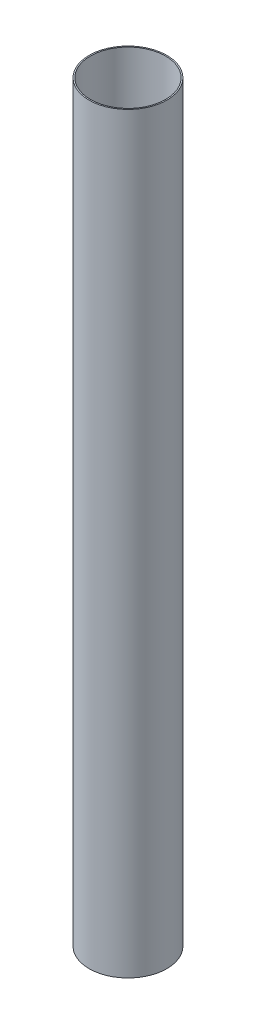
ISO-10303-21;
HEADER;
FILE_DESCRIPTION(('STEP AP214'),'2;1');
FILE_NAME('part.step','',(''),(''),'','','');
FILE_SCHEMA(('AUTOMOTIVE_DESIGN { 1 0 10303 214 1 1 1 1 }'));
ENDSEC;
DATA;
#1=APPLICATION_CONTEXT('core data for automotive mechanical design processes');
#2=APPLICATION_PROTOCOL_DEFINITION('international standard','automotive_design',2000,#1);
#3=PRODUCT_CONTEXT('',#1,'mechanical');
#4=PRODUCT('Part','Part','',(#3));
#5=PRODUCT_RELATED_PRODUCT_CATEGORY('part','',(#4));
#6=PRODUCT_DEFINITION_FORMATION('','',#4);
#7=PRODUCT_DEFINITION_CONTEXT('part definition',#1,'design');
#8=PRODUCT_DEFINITION('design','',#6,#7);
#9=PRODUCT_DEFINITION_SHAPE('','',#8);
#10=(LENGTH_UNIT() NAMED_UNIT(*) SI_UNIT(.MILLI.,.METRE.));
#11=(NAMED_UNIT(*) PLANE_ANGLE_UNIT() SI_UNIT($,.RADIAN.));
#12=(NAMED_UNIT(*) SI_UNIT($,.STERADIAN.) SOLID_ANGLE_UNIT());
#13=UNCERTAINTY_MEASURE_WITH_UNIT(LENGTH_MEASURE(1.E-05),#10,'distance_accuracy_value','');
#14=(GEOMETRIC_REPRESENTATION_CONTEXT(3) GLOBAL_UNCERTAINTY_ASSIGNED_CONTEXT((#13)) GLOBAL_UNIT_ASSIGNED_CONTEXT((#10,
#11,#12)) REPRESENTATION_CONTEXT('',''));
#15=CARTESIAN_POINT('',(0.,0.,0.));
#16=DIRECTION('',(0.,0.,1.));
#17=DIRECTION('',(1.,0.,0.));
#18=AXIS2_PLACEMENT_3D('',#15,#16,#17);
#19=CARTESIAN_POINT('',(0.,762.,0.));
#20=DIRECTION('',(0.,1.,0.));
#21=DIRECTION('',(0.,0.,1.));
#22=AXIS2_PLACEMENT_3D('',#19,#20,#21);
#23=PLANE('',#22);
#24=CARTESIAN_POINT('',(0.,762.,0.));
#25=DIRECTION('',(0.,1.,0.));
#26=DIRECTION('',(0.,0.,1.));
#27=AXIS2_PLACEMENT_3D('',#24,#25,#26);
#28=CIRCLE('',#27,39.37);
#29=CARTESIAN_POINT('',(0.,762.,39.37));
#30=VERTEX_POINT('',#29);
#31=EDGE_CURVE('E10',#30,#30,#28,.T.);
#32=ORIENTED_EDGE('',*,*,#31,.T.);
#33=EDGE_LOOP('',(#32));
#34=FACE_BOUND('',#33,.T.);
#35=CARTESIAN_POINT('',(0.,762.,0.));
#36=DIRECTION('',(0.,1.,0.));
#37=DIRECTION('',(0.,0.,1.));
#38=AXIS2_PLACEMENT_3D('',#35,#36,#37);
#39=CIRCLE('',#38,38.1);
#40=CARTESIAN_POINT('',(0.,762.,38.1));
#41=VERTEX_POINT('',#40);
#42=EDGE_CURVE('E50',#41,#41,#39,.T.);
#43=ORIENTED_EDGE('',*,*,#42,.F.);
#44=EDGE_LOOP('',(#43));
#45=FACE_BOUND('',#44,.T.);
#46=ADVANCED_FACE('F37',(#34,#45),#23,.T.);
#47=CARTESIAN_POINT('',(0.,0.,0.));
#48=DIRECTION('',(0.,1.,0.));
#49=DIRECTION('',(0.,0.,1.));
#50=AXIS2_PLACEMENT_3D('',#47,#48,#49);
#51=PLANE('',#50);
#52=CARTESIAN_POINT('',(0.,0.,0.));
#53=DIRECTION('',(0.,1.,0.));
#54=DIRECTION('',(0.,0.,1.));
#55=AXIS2_PLACEMENT_3D('',#52,#53,#54);
#56=CIRCLE('',#55,39.37);
#57=CARTESIAN_POINT('',(0.,0.,39.37));
#58=VERTEX_POINT('',#57);
#59=EDGE_CURVE('E41',#58,#58,#56,.T.);
#60=ORIENTED_EDGE('',*,*,#59,.F.);
#61=EDGE_LOOP('',(#60));
#62=FACE_BOUND('',#61,.T.);
#63=CARTESIAN_POINT('',(0.,0.,0.));
#64=DIRECTION('',(0.,1.,0.));
#65=DIRECTION('',(0.,0.,1.));
#66=AXIS2_PLACEMENT_3D('',#63,#64,#65);
#67=CIRCLE('',#66,38.1);
#68=CARTESIAN_POINT('',(0.,0.,38.1));
#69=VERTEX_POINT('',#68);
#70=EDGE_CURVE('E52',#69,#69,#67,.T.);
#71=ORIENTED_EDGE('',*,*,#70,.T.);
#72=EDGE_LOOP('',(#71));
#73=FACE_BOUND('',#72,.T.);
#74=ADVANCED_FACE('F64',(#62,#73),#51,.F.);
#75=CARTESIAN_POINT('',(0.,762.,0.));
#76=DIRECTION('',(0.,-1.,0.));
#77=DIRECTION('',(0.,0.,-1.));
#78=AXIS2_PLACEMENT_3D('',#75,#76,#77);
#79=CYLINDRICAL_SURFACE('',#78,39.37);
#80=ORIENTED_EDGE('',*,*,#31,.F.);
#81=EDGE_LOOP('',(#80));
#82=FACE_BOUND('',#81,.T.);
#83=ORIENTED_EDGE('',*,*,#59,.T.);
#84=EDGE_LOOP('',(#83));
#85=FACE_BOUND('',#84,.T.);
#86=ADVANCED_FACE('F39',(#82,#85),#79,.T.);
#87=CARTESIAN_POINT('',(0.,762.,0.));
#88=DIRECTION('',(0.,-1.,0.));
#89=DIRECTION('',(0.,0.,-1.));
#90=AXIS2_PLACEMENT_3D('',#87,#88,#89);
#91=CYLINDRICAL_SURFACE('',#90,38.1);
#92=ORIENTED_EDGE('',*,*,#42,.T.);
#93=EDGE_LOOP('',(#92));
#94=FACE_BOUND('',#93,.T.);
#95=ORIENTED_EDGE('',*,*,#70,.F.);
#96=EDGE_LOOP('',(#95));
#97=FACE_BOUND('',#96,.T.);
#98=ADVANCED_FACE('F60',(#94,#97),#91,.F.);
#99=CLOSED_SHELL('',(#46,#74,#86,#98));
#100=MANIFOLD_SOLID_BREP('B2',#99);
#101=ADVANCED_BREP_SHAPE_REPRESENTATION('',(#18,#100),#14);
#102=SHAPE_DEFINITION_REPRESENTATION(#9,#101);
ENDSEC;
END-ISO-10303-21;
